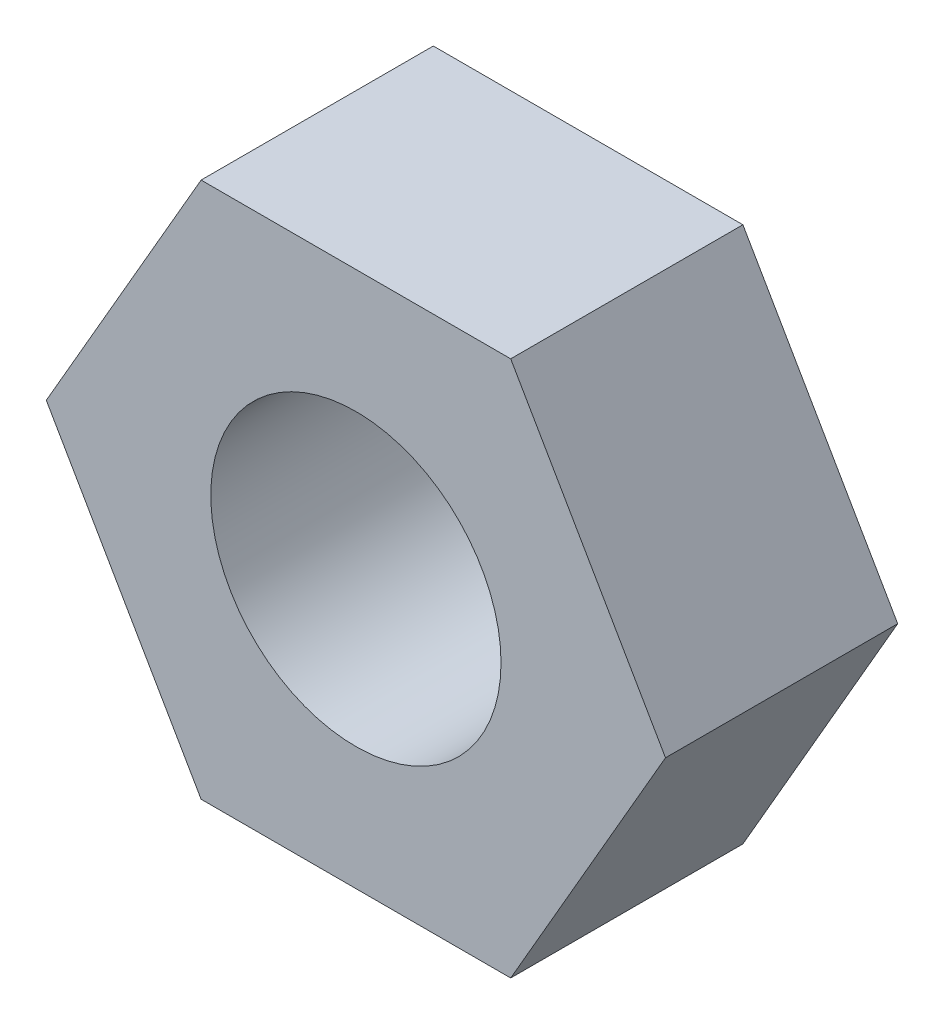
ISO-10303-21;
HEADER;
FILE_DESCRIPTION(('STEP AP214'),'2;1');
FILE_NAME('part.step','',(''),(''),'','','');
FILE_SCHEMA(('AUTOMOTIVE_DESIGN { 1 0 10303 214 1 1 1 1 }'));
ENDSEC;
DATA;
#1=APPLICATION_CONTEXT('core data for automotive mechanical design processes');
#2=APPLICATION_PROTOCOL_DEFINITION('international standard','automotive_design',2000,#1);
#3=PRODUCT_CONTEXT('',#1,'mechanical');
#4=PRODUCT('Part','Part','',(#3));
#5=PRODUCT_RELATED_PRODUCT_CATEGORY('part','',(#4));
#6=PRODUCT_DEFINITION_FORMATION('','',#4);
#7=PRODUCT_DEFINITION_CONTEXT('part definition',#1,'design');
#8=PRODUCT_DEFINITION('design','',#6,#7);
#9=PRODUCT_DEFINITION_SHAPE('','',#8);
#10=(LENGTH_UNIT() NAMED_UNIT(*) SI_UNIT(.MILLI.,.METRE.));
#11=(NAMED_UNIT(*) PLANE_ANGLE_UNIT() SI_UNIT($,.RADIAN.));
#12=(NAMED_UNIT(*) SI_UNIT($,.STERADIAN.) SOLID_ANGLE_UNIT());
#13=UNCERTAINTY_MEASURE_WITH_UNIT(LENGTH_MEASURE(1.E-05),#10,'distance_accuracy_value','');
#14=(GEOMETRIC_REPRESENTATION_CONTEXT(3) GLOBAL_UNCERTAINTY_ASSIGNED_CONTEXT((#13)) GLOBAL_UNIT_ASSIGNED_CONTEXT((#10,
#11,#12)) REPRESENTATION_CONTEXT('',''));
#15=CARTESIAN_POINT('',(0.,0.,0.));
#16=DIRECTION('',(0.,0.,1.));
#17=DIRECTION('',(1.,0.,0.));
#18=AXIS2_PLACEMENT_3D('',#15,#16,#17);
#19=CARTESIAN_POINT('',(-1.60000000000001,-2.7712812921102,2.4));
#20=DIRECTION('',(0.,0.,1.));
#21=DIRECTION('',(1.,0.,0.));
#22=AXIS2_PLACEMENT_3D('',#19,#20,#21);
#23=PLANE('',#22);
#24=DIRECTION('',(0.499999999999998,-0.86602540378444,0.));
#25=VECTOR('',#24,1.);
#26=CARTESIAN_POINT('',(-3.2,0.,2.4));
#27=LINE('',#26,#25);
#28=CARTESIAN_POINT('',(-3.2,0.,2.4));
#29=VERTEX_POINT('',#28);
#30=CARTESIAN_POINT('',(-1.60000000000001,-2.7712812921102,2.4));
#31=VERTEX_POINT('',#30);
#32=EDGE_CURVE('E127',#29,#31,#27,.T.);
#33=ORIENTED_EDGE('',*,*,#32,.T.);
#34=DIRECTION('',(1.,0.,0.));
#35=VECTOR('',#34,1.);
#36=CARTESIAN_POINT('',(-1.60000000000001,-2.7712812921102,2.4));
#37=LINE('',#36,#35);
#38=CARTESIAN_POINT('',(1.59999999999999,-2.77128129211021,2.4));
#39=VERTEX_POINT('',#38);
#40=EDGE_CURVE('E85',#31,#39,#37,.T.);
#41=ORIENTED_EDGE('',*,*,#40,.T.);
#42=DIRECTION('',(0.500000000000001,0.866025403784438,0.));
#43=VECTOR('',#42,1.);
#44=CARTESIAN_POINT('',(1.59999999999999,-2.77128129211021,2.4));
#45=LINE('',#44,#43);
#46=CARTESIAN_POINT('',(3.2,0.,2.4));
#47=VERTEX_POINT('',#46);
#48=EDGE_CURVE('E98',#39,#47,#45,.T.);
#49=ORIENTED_EDGE('',*,*,#48,.T.);
#50=DIRECTION('',(-0.499999999999998,0.86602540378444,0.));
#51=VECTOR('',#50,1.);
#52=CARTESIAN_POINT('',(3.2,0.,2.4));
#53=LINE('',#52,#51);
#54=CARTESIAN_POINT('',(1.60000000000001,2.7712812921102,2.4));
#55=VERTEX_POINT('',#54);
#56=EDGE_CURVE('E92',#47,#55,#53,.T.);
#57=ORIENTED_EDGE('',*,*,#56,.T.);
#58=DIRECTION('',(-1.,0.,0.));
#59=VECTOR('',#58,1.);
#60=CARTESIAN_POINT('',(1.60000000000001,2.7712812921102,2.4));
#61=LINE('',#60,#59);
#62=CARTESIAN_POINT('',(-1.59999999999999,2.77128129211021,2.4));
#63=VERTEX_POINT('',#62);
#64=EDGE_CURVE('E96',#55,#63,#61,.T.);
#65=ORIENTED_EDGE('',*,*,#64,.T.);
#66=DIRECTION('',(-0.500000000000001,-0.866025403784438,0.));
#67=VECTOR('',#66,1.);
#68=CARTESIAN_POINT('',(-1.59999999999999,2.77128129211021,2.4));
#69=LINE('',#68,#67);
#70=EDGE_CURVE('E48',#63,#29,#69,.T.);
#71=ORIENTED_EDGE('',*,*,#70,.T.);
#72=EDGE_LOOP('',(#33,#41,#49,#57,#65,#71));
#73=FACE_BOUND('',#72,.T.);
#74=CARTESIAN_POINT('',(0.,0.,2.4));
#75=DIRECTION('',(0.,0.,1.));
#76=DIRECTION('',(1.,0.,0.));
#77=AXIS2_PLACEMENT_3D('',#74,#75,#76);
#78=CIRCLE('',#77,1.5);
#79=CARTESIAN_POINT('',(1.5,0.,2.4));
#80=VERTEX_POINT('',#79);
#81=EDGE_CURVE('E120',#80,#80,#78,.T.);
#82=ORIENTED_EDGE('',*,*,#81,.F.);
#83=EDGE_LOOP('',(#82));
#84=FACE_BOUND('',#83,.T.);
#85=ADVANCED_FACE('F31',(#73,#84),#23,.T.);
#86=CARTESIAN_POINT('',(-1.60000000000001,-2.7712812921102,0.));
#87=DIRECTION('',(0.,0.,1.));
#88=DIRECTION('',(1.,0.,0.));
#89=AXIS2_PLACEMENT_3D('',#86,#87,#88);
#90=PLANE('',#89);
#91=DIRECTION('',(0.499999999999998,-0.86602540378444,0.));
#92=VECTOR('',#91,1.);
#93=CARTESIAN_POINT('',(-3.2,0.,0.));
#94=LINE('',#93,#92);
#95=CARTESIAN_POINT('',(-3.2,0.,0.));
#96=VERTEX_POINT('',#95);
#97=CARTESIAN_POINT('',(-1.60000000000001,-2.7712812921102,0.));
#98=VERTEX_POINT('',#97);
#99=EDGE_CURVE('E116',#96,#98,#94,.T.);
#100=ORIENTED_EDGE('',*,*,#99,.F.);
#101=DIRECTION('',(-0.500000000000001,-0.866025403784438,0.));
#102=VECTOR('',#101,1.);
#103=CARTESIAN_POINT('',(-1.59999999999999,2.77128129211021,0.));
#104=LINE('',#103,#102);
#105=CARTESIAN_POINT('',(-1.59999999999999,2.77128129211021,0.));
#106=VERTEX_POINT('',#105);
#107=EDGE_CURVE('E77',#106,#96,#104,.T.);
#108=ORIENTED_EDGE('',*,*,#107,.F.);
#109=DIRECTION('',(-1.,0.,0.));
#110=VECTOR('',#109,1.);
#111=CARTESIAN_POINT('',(1.60000000000001,2.7712812921102,0.));
#112=LINE('',#111,#110);
#113=CARTESIAN_POINT('',(1.60000000000001,2.7712812921102,0.));
#114=VERTEX_POINT('',#113);
#115=EDGE_CURVE('E71',#114,#106,#112,.T.);
#116=ORIENTED_EDGE('',*,*,#115,.F.);
#117=DIRECTION('',(-0.499999999999998,0.86602540378444,0.));
#118=VECTOR('',#117,1.);
#119=CARTESIAN_POINT('',(3.2,0.,0.));
#120=LINE('',#119,#118);
#121=CARTESIAN_POINT('',(3.2,0.,0.));
#122=VERTEX_POINT('',#121);
#123=EDGE_CURVE('E106',#122,#114,#120,.T.);
#124=ORIENTED_EDGE('',*,*,#123,.F.);
#125=DIRECTION('',(0.500000000000001,0.866025403784438,0.));
#126=VECTOR('',#125,1.);
#127=CARTESIAN_POINT('',(1.59999999999999,-2.77128129211021,0.));
#128=LINE('',#127,#126);
#129=CARTESIAN_POINT('',(1.59999999999999,-2.77128129211021,0.));
#130=VERTEX_POINT('',#129);
#131=EDGE_CURVE('E122',#130,#122,#128,.T.);
#132=ORIENTED_EDGE('',*,*,#131,.F.);
#133=DIRECTION('',(1.,0.,0.));
#134=VECTOR('',#133,1.);
#135=CARTESIAN_POINT('',(-1.60000000000001,-2.7712812921102,0.));
#136=LINE('',#135,#134);
#137=EDGE_CURVE('E119',#98,#130,#136,.T.);
#138=ORIENTED_EDGE('',*,*,#137,.F.);
#139=EDGE_LOOP('',(#100,#108,#116,#124,#132,#138));
#140=FACE_BOUND('',#139,.T.);
#141=CARTESIAN_POINT('',(0.,0.,0.));
#142=DIRECTION('',(0.,0.,1.));
#143=DIRECTION('',(1.,0.,0.));
#144=AXIS2_PLACEMENT_3D('',#141,#142,#143);
#145=CIRCLE('',#144,1.5);
#146=CARTESIAN_POINT('',(1.5,0.,0.));
#147=VERTEX_POINT('',#146);
#148=EDGE_CURVE('E220',#147,#147,#145,.T.);
#149=ORIENTED_EDGE('',*,*,#148,.T.);
#150=EDGE_LOOP('',(#149));
#151=FACE_BOUND('',#150,.T.);
#152=ADVANCED_FACE('F136',(#140,#151),#90,.F.);
#153=CARTESIAN_POINT('',(-3.2,0.,2.4));
#154=DIRECTION('',(0.86602540378444,0.499999999999998,0.));
#155=DIRECTION('',(-0.499999999999998,0.86602540378444,0.));
#156=AXIS2_PLACEMENT_3D('',#153,#154,#155);
#157=PLANE('',#156);
#158=ORIENTED_EDGE('',*,*,#99,.T.);
#159=DIRECTION('',(0.,0.,-1.));
#160=VECTOR('',#159,1.);
#161=CARTESIAN_POINT('',(-1.60000000000001,-2.7712812921102,2.4));
#162=LINE('',#161,#160);
#163=EDGE_CURVE('E11',#31,#98,#162,.T.);
#164=ORIENTED_EDGE('',*,*,#163,.F.);
#165=ORIENTED_EDGE('',*,*,#32,.F.);
#166=DIRECTION('',(0.,0.,-1.));
#167=VECTOR('',#166,1.);
#168=CARTESIAN_POINT('',(-3.2,0.,2.4));
#169=LINE('',#168,#167);
#170=EDGE_CURVE('E112',#29,#96,#169,.T.);
#171=ORIENTED_EDGE('',*,*,#170,.T.);
#172=EDGE_LOOP('',(#158,#164,#165,#171));
#173=FACE_BOUND('',#172,.T.);
#174=ADVANCED_FACE('F33',(#173),#157,.F.);
#175=CARTESIAN_POINT('',(-1.60000000000001,-2.7712812921102,2.4));
#176=DIRECTION('',(0.,1.,0.));
#177=DIRECTION('',(-1.,0.,0.));
#178=AXIS2_PLACEMENT_3D('',#175,#176,#177);
#179=PLANE('',#178);
#180=ORIENTED_EDGE('',*,*,#137,.T.);
#181=DIRECTION('',(0.,0.,-1.));
#182=VECTOR('',#181,1.);
#183=CARTESIAN_POINT('',(1.59999999999999,-2.77128129211021,2.4));
#184=LINE('',#183,#182);
#185=EDGE_CURVE('E40',#39,#130,#184,.T.);
#186=ORIENTED_EDGE('',*,*,#185,.F.);
#187=ORIENTED_EDGE('',*,*,#40,.F.);
#188=ORIENTED_EDGE('',*,*,#163,.T.);
#189=EDGE_LOOP('',(#180,#186,#187,#188));
#190=FACE_BOUND('',#189,.T.);
#191=ADVANCED_FACE('F161',(#190),#179,.F.);
#192=CARTESIAN_POINT('',(1.59999999999999,-2.77128129211021,2.4));
#193=DIRECTION('',(-0.866025403784438,0.500000000000001,0.));
#194=DIRECTION('',(-0.500000000000001,-0.866025403784438,0.));
#195=AXIS2_PLACEMENT_3D('',#192,#193,#194);
#196=PLANE('',#195);
#197=ORIENTED_EDGE('',*,*,#131,.T.);
#198=DIRECTION('',(0.,0.,-1.));
#199=VECTOR('',#198,1.);
#200=CARTESIAN_POINT('',(3.2,0.,2.4));
#201=LINE('',#200,#199);
#202=EDGE_CURVE('E107',#47,#122,#201,.T.);
#203=ORIENTED_EDGE('',*,*,#202,.F.);
#204=ORIENTED_EDGE('',*,*,#48,.F.);
#205=ORIENTED_EDGE('',*,*,#185,.T.);
#206=EDGE_LOOP('',(#197,#203,#204,#205));
#207=FACE_BOUND('',#206,.T.);
#208=ADVANCED_FACE('F133',(#207),#196,.F.);
#209=CARTESIAN_POINT('',(3.2,0.,2.4));
#210=DIRECTION('',(-0.86602540378444,-0.499999999999998,0.));
#211=DIRECTION('',(0.499999999999998,-0.86602540378444,0.));
#212=AXIS2_PLACEMENT_3D('',#209,#210,#211);
#213=PLANE('',#212);
#214=ORIENTED_EDGE('',*,*,#123,.T.);
#215=DIRECTION('',(0.,0.,-1.));
#216=VECTOR('',#215,1.);
#217=CARTESIAN_POINT('',(1.60000000000001,2.7712812921102,2.4));
#218=LINE('',#217,#216);
#219=EDGE_CURVE('E103',#55,#114,#218,.T.);
#220=ORIENTED_EDGE('',*,*,#219,.F.);
#221=ORIENTED_EDGE('',*,*,#56,.F.);
#222=ORIENTED_EDGE('',*,*,#202,.T.);
#223=EDGE_LOOP('',(#214,#220,#221,#222));
#224=FACE_BOUND('',#223,.T.);
#225=ADVANCED_FACE('F104',(#224),#213,.F.);
#226=CARTESIAN_POINT('',(1.60000000000001,2.7712812921102,2.4));
#227=DIRECTION('',(0.,-1.,0.));
#228=DIRECTION('',(1.,0.,0.));
#229=AXIS2_PLACEMENT_3D('',#226,#227,#228);
#230=PLANE('',#229);
#231=ORIENTED_EDGE('',*,*,#115,.T.);
#232=DIRECTION('',(0.,0.,-1.));
#233=VECTOR('',#232,1.);
#234=CARTESIAN_POINT('',(-1.59999999999999,2.77128129211021,2.4));
#235=LINE('',#234,#233);
#236=EDGE_CURVE('E108',#63,#106,#235,.T.);
#237=ORIENTED_EDGE('',*,*,#236,.F.);
#238=ORIENTED_EDGE('',*,*,#64,.F.);
#239=ORIENTED_EDGE('',*,*,#219,.T.);
#240=EDGE_LOOP('',(#231,#237,#238,#239));
#241=FACE_BOUND('',#240,.T.);
#242=ADVANCED_FACE('F110',(#241),#230,.F.);
#243=CARTESIAN_POINT('',(-1.59999999999999,2.77128129211021,2.4));
#244=DIRECTION('',(0.866025403784438,-0.500000000000001,0.));
#245=DIRECTION('',(0.500000000000001,0.866025403784438,0.));
#246=AXIS2_PLACEMENT_3D('',#243,#244,#245);
#247=PLANE('',#246);
#248=ORIENTED_EDGE('',*,*,#107,.T.);
#249=ORIENTED_EDGE('',*,*,#170,.F.);
#250=ORIENTED_EDGE('',*,*,#70,.F.);
#251=ORIENTED_EDGE('',*,*,#236,.T.);
#252=EDGE_LOOP('',(#248,#249,#250,#251));
#253=FACE_BOUND('',#252,.T.);
#254=ADVANCED_FACE('F141',(#253),#247,.F.);
#255=CARTESIAN_POINT('',(0.,0.,2.4));
#256=DIRECTION('',(0.,0.,-1.));
#257=DIRECTION('',(-1.,0.,0.));
#258=AXIS2_PLACEMENT_3D('',#255,#256,#257);
#259=CYLINDRICAL_SURFACE('',#258,1.5);
#260=ORIENTED_EDGE('',*,*,#81,.T.);
#261=EDGE_LOOP('',(#260));
#262=FACE_BOUND('',#261,.T.);
#263=ORIENTED_EDGE('',*,*,#148,.F.);
#264=EDGE_LOOP('',(#263));
#265=FACE_BOUND('',#264,.T.);
#266=ADVANCED_FACE('F143',(#262,#265),#259,.F.);
#267=CLOSED_SHELL('',(#85,#152,#174,#191,#208,#225,#242,#254,#266));
#268=MANIFOLD_SOLID_BREP('B2',#267);
#269=ADVANCED_BREP_SHAPE_REPRESENTATION('',(#18,#268),#14);
#270=SHAPE_DEFINITION_REPRESENTATION(#9,#269);
ENDSEC;
END-ISO-10303-21;
